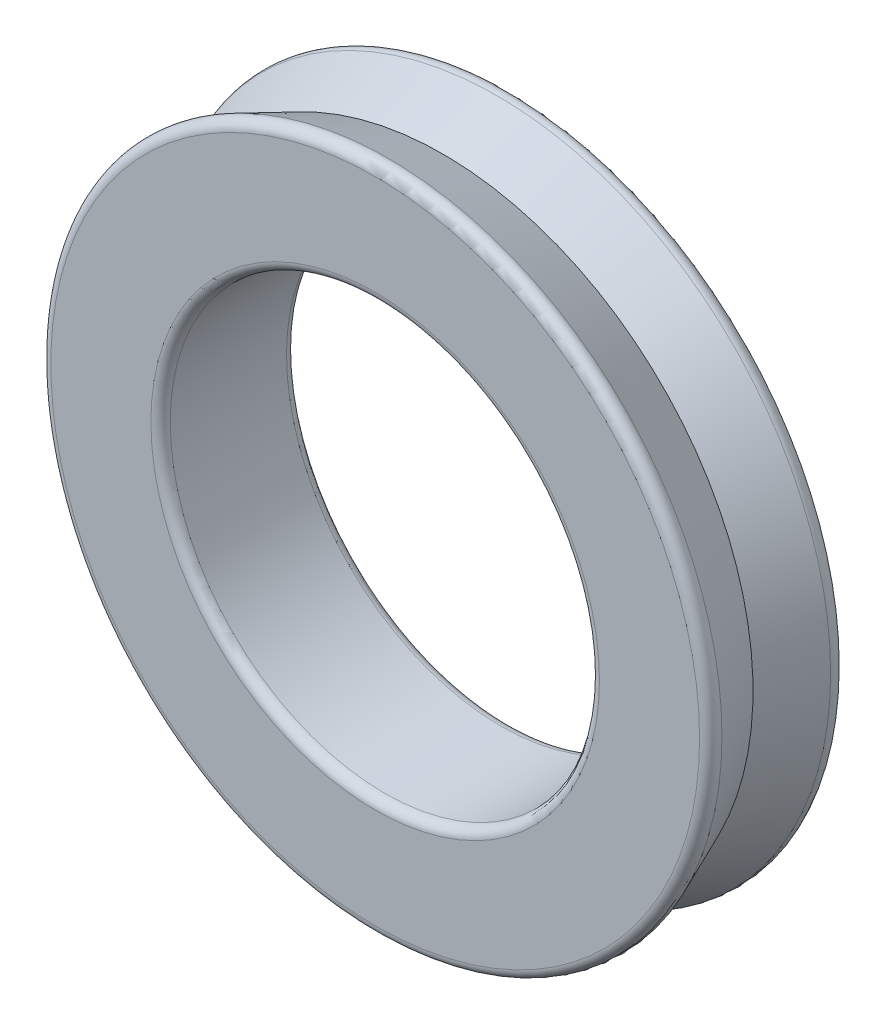
ISO-10303-21;
HEADER;
FILE_DESCRIPTION(('STEP AP214'),'2;1');
FILE_NAME('part.step','',(''),(''),'','','');
FILE_SCHEMA(('AUTOMOTIVE_DESIGN { 1 0 10303 214 1 1 1 1 }'));
ENDSEC;
DATA;
#1=APPLICATION_CONTEXT('core data for automotive mechanical design processes');
#2=APPLICATION_PROTOCOL_DEFINITION('international standard','automotive_design',2000,#1);
#3=PRODUCT_CONTEXT('',#1,'mechanical');
#4=PRODUCT('Part','Part','',(#3));
#5=PRODUCT_RELATED_PRODUCT_CATEGORY('part','',(#4));
#6=PRODUCT_DEFINITION_FORMATION('','',#4);
#7=PRODUCT_DEFINITION_CONTEXT('part definition',#1,'design');
#8=PRODUCT_DEFINITION('design','',#6,#7);
#9=PRODUCT_DEFINITION_SHAPE('','',#8);
#10=(LENGTH_UNIT() NAMED_UNIT(*) SI_UNIT(.MILLI.,.METRE.));
#11=(NAMED_UNIT(*) PLANE_ANGLE_UNIT() SI_UNIT($,.RADIAN.));
#12=(NAMED_UNIT(*) SI_UNIT($,.STERADIAN.) SOLID_ANGLE_UNIT());
#13=UNCERTAINTY_MEASURE_WITH_UNIT(LENGTH_MEASURE(1.E-05),#10,'distance_accuracy_value','');
#14=(GEOMETRIC_REPRESENTATION_CONTEXT(3) GLOBAL_UNCERTAINTY_ASSIGNED_CONTEXT((#13)) GLOBAL_UNIT_ASSIGNED_CONTEXT((#10,
#11,#12)) REPRESENTATION_CONTEXT('',''));
#15=CARTESIAN_POINT('',(0.,0.,0.));
#16=DIRECTION('',(0.,0.,1.));
#17=DIRECTION('',(1.,0.,0.));
#18=AXIS2_PLACEMENT_3D('',#15,#16,#17);
#19=CARTESIAN_POINT('',(0.,0.,7.));
#20=DIRECTION('',(0.,0.,1.));
#21=DIRECTION('',(1.,0.,0.));
#22=AXIS2_PLACEMENT_3D('',#19,#20,#21);
#23=PLANE('',#22);
#24=CARTESIAN_POINT('',(0.,0.,7.));
#25=DIRECTION('',(0.,0.,1.));
#26=DIRECTION('',(1.,0.,0.));
#27=AXIS2_PLACEMENT_3D('',#24,#25,#26);
#28=CIRCLE('',#27,11.575);
#29=CARTESIAN_POINT('',(11.575,0.,7.));
#30=VERTEX_POINT('',#29);
#31=EDGE_CURVE('E42',#30,#30,#28,.F.);
#32=ORIENTED_EDGE('',*,*,#31,.T.);
#33=EDGE_LOOP('',(#32));
#34=FACE_BOUND('',#33,.T.);
#35=CARTESIAN_POINT('',(0.,0.,7.));
#36=DIRECTION('',(0.,0.,1.));
#37=DIRECTION('',(1.,0.,0.));
#38=AXIS2_PLACEMENT_3D('',#35,#36,#37);
#39=CIRCLE('',#38,16.7417304924383);
#40=CARTESIAN_POINT('',(16.7417304924383,0.,7.));
#41=VERTEX_POINT('',#40);
#42=EDGE_CURVE('E61',#41,#41,#39,.T.);
#43=ORIENTED_EDGE('',*,*,#42,.T.);
#44=EDGE_LOOP('',(#43));
#45=FACE_BOUND('',#44,.T.);
#46=ADVANCED_FACE('F35',(#34,#45),#23,.T.);
#47=CARTESIAN_POINT('',(0.,0.,0.));
#48=DIRECTION('',(0.,0.,1.));
#49=DIRECTION('',(1.,0.,0.));
#50=AXIS2_PLACEMENT_3D('',#47,#48,#49);
#51=PLANE('',#50);
#52=CARTESIAN_POINT('',(0.,0.,0.));
#53=DIRECTION('',(0.,0.,1.));
#54=DIRECTION('',(1.,0.,0.));
#55=AXIS2_PLACEMENT_3D('',#52,#53,#54);
#56=CIRCLE('',#55,11.575);
#57=CARTESIAN_POINT('',(11.575,0.,0.));
#58=VERTEX_POINT('',#57);
#59=EDGE_CURVE('E10',#58,#58,#56,.T.);
#60=ORIENTED_EDGE('',*,*,#59,.T.);
#61=EDGE_LOOP('',(#60));
#62=FACE_BOUND('',#61,.T.);
#63=CARTESIAN_POINT('',(0.,0.,0.));
#64=DIRECTION('',(0.,0.,1.));
#65=DIRECTION('',(1.,0.,0.));
#66=AXIS2_PLACEMENT_3D('',#63,#64,#65);
#67=CIRCLE('',#66,16.7417304924383);
#68=CARTESIAN_POINT('',(16.7417304924383,0.,0.));
#69=VERTEX_POINT('',#68);
#70=EDGE_CURVE('E58',#69,#69,#67,.F.);
#71=ORIENTED_EDGE('',*,*,#70,.T.);
#72=EDGE_LOOP('',(#71));
#73=FACE_BOUND('',#72,.T.);
#74=ADVANCED_FACE('F89',(#62,#73),#51,.F.);
#75=CARTESIAN_POINT('',(0.,0.,7.));
#76=DIRECTION('',(0.,0.,-1.));
#77=DIRECTION('',(-1.,0.,0.));
#78=AXIS2_PLACEMENT_3D('',#75,#76,#77);
#79=CYLINDRICAL_SURFACE('',#78,11.075);
#80=CARTESIAN_POINT('',(0.,0.,6.5));
#81=DIRECTION('',(0.,0.,1.));
#82=DIRECTION('',(1.,0.,0.));
#83=AXIS2_PLACEMENT_3D('',#80,#81,#82);
#84=CIRCLE('',#83,11.075);
#85=CARTESIAN_POINT('',(11.075,0.,6.5));
#86=VERTEX_POINT('',#85);
#87=EDGE_CURVE('E46',#86,#86,#84,.T.);
#88=ORIENTED_EDGE('',*,*,#87,.T.);
#89=EDGE_LOOP('',(#88));
#90=FACE_BOUND('',#89,.T.);
#91=CARTESIAN_POINT('',(0.,0.,0.5));
#92=DIRECTION('',(0.,0.,1.));
#93=DIRECTION('',(1.,0.,0.));
#94=AXIS2_PLACEMENT_3D('',#91,#92,#93);
#95=CIRCLE('',#94,11.075);
#96=CARTESIAN_POINT('',(11.075,0.,0.5));
#97=VERTEX_POINT('',#96);
#98=EDGE_CURVE('E50',#97,#97,#95,.F.);
#99=ORIENTED_EDGE('',*,*,#98,.T.);
#100=EDGE_LOOP('',(#99));
#101=FACE_BOUND('',#100,.T.);
#102=ADVANCED_FACE('F85',(#90,#101),#79,.F.);
#103=CARTESIAN_POINT('',(0.,0.,0.));
#104=DIRECTION('',(0.,0.,-1.));
#105=DIRECTION('',(-1.,0.,0.));
#106=AXIS2_PLACEMENT_3D('',#103,#104,#105);
#107=CONICAL_SURFACE('',#106,17.5,0.404891786285085);
#108=CARTESIAN_POINT('',(0.,0.,0.696959649289584));
#109=DIRECTION('',(0.,0.,-1.));
#110=DIRECTION('',(-1.,0.,0.));
#111=AXIS2_PLACEMENT_3D('',#108,#109,#110);
#112=CIRCLE('',#111,17.2013030074473);
#113=CARTESIAN_POINT('',(-17.2013030074473,0.,0.696959649289584));
#114=VERTEX_POINT('',#113);
#115=EDGE_CURVE('E55',#114,#114,#112,.F.);
#116=ORIENTED_EDGE('',*,*,#115,.T.);
#117=EDGE_LOOP('',(#116));
#118=FACE_BOUND('',#117,.T.);
#119=CARTESIAN_POINT('',(0.,0.,3.5));
#120=DIRECTION('',(0.,0.,-1.));
#121=DIRECTION('',(-1.,0.,0.));
#122=AXIS2_PLACEMENT_3D('',#119,#120,#121);
#123=CIRCLE('',#122,16.);
#124=CARTESIAN_POINT('',(-16.,0.,3.5));
#125=VERTEX_POINT('',#124);
#126=EDGE_CURVE('E67',#125,#125,#123,.T.);
#127=ORIENTED_EDGE('',*,*,#126,.T.);
#128=EDGE_LOOP('',(#127));
#129=FACE_BOUND('',#128,.T.);
#130=ADVANCED_FACE('F71',(#118,#129),#107,.T.);
#131=CARTESIAN_POINT('',(0.,0.,3.5));
#132=DIRECTION('',(0.,0.,1.));
#133=DIRECTION('',(1.,0.,0.));
#134=AXIS2_PLACEMENT_3D('',#131,#132,#133);
#135=CONICAL_SURFACE('',#134,16.,0.404891786285085);
#136=CARTESIAN_POINT('',(0.,0.,6.30304035071042));
#137=DIRECTION('',(0.,0.,-1.));
#138=DIRECTION('',(-1.,0.,0.));
#139=AXIS2_PLACEMENT_3D('',#136,#137,#138);
#140=CIRCLE('',#139,17.2013030074473);
#141=CARTESIAN_POINT('',(-17.2013030074473,0.,6.30304035071042));
#142=VERTEX_POINT('',#141);
#143=EDGE_CURVE('E64',#142,#142,#140,.T.);
#144=ORIENTED_EDGE('',*,*,#143,.T.);
#145=EDGE_LOOP('',(#144));
#146=FACE_BOUND('',#145,.T.);
#147=ORIENTED_EDGE('',*,*,#126,.F.);
#148=EDGE_LOOP('',(#147));
#149=FACE_BOUND('',#148,.T.);
#150=ADVANCED_FACE('F73',(#146,#149),#135,.T.);
#151=CARTESIAN_POINT('',(0.,0.,6.5));
#152=DIRECTION('',(0.,0.,1.));
#153=DIRECTION('',(1.,0.,0.));
#154=AXIS2_PLACEMENT_3D('',#151,#152,#153);
#155=TOROIDAL_SURFACE('',#154,16.7417304924383,0.5);
#156=ORIENTED_EDGE('',*,*,#42,.F.);
#157=EDGE_LOOP('',(#156));
#158=FACE_BOUND('',#157,.T.);
#159=ORIENTED_EDGE('',*,*,#143,.F.);
#160=EDGE_LOOP('',(#159));
#161=FACE_BOUND('',#160,.T.);
#162=ADVANCED_FACE('F75',(#158,#161),#155,.T.);
#163=CARTESIAN_POINT('',(0.,0.,0.5));
#164=DIRECTION('',(0.,0.,1.));
#165=DIRECTION('',(1.,0.,0.));
#166=AXIS2_PLACEMENT_3D('',#163,#164,#165);
#167=TOROIDAL_SURFACE('',#166,16.7417304924383,0.5);
#168=ORIENTED_EDGE('',*,*,#115,.F.);
#169=EDGE_LOOP('',(#168));
#170=FACE_BOUND('',#169,.T.);
#171=ORIENTED_EDGE('',*,*,#70,.F.);
#172=EDGE_LOOP('',(#171));
#173=FACE_BOUND('',#172,.T.);
#174=ADVANCED_FACE('F82',(#170,#173),#167,.T.);
#175=CARTESIAN_POINT('',(0.,0.,6.5));
#176=DIRECTION('',(0.,0.,1.));
#177=DIRECTION('',(1.,0.,0.));
#178=AXIS2_PLACEMENT_3D('',#175,#176,#177);
#179=TOROIDAL_SURFACE('',#178,11.575,0.5);
#180=ORIENTED_EDGE('',*,*,#31,.F.);
#181=EDGE_LOOP('',(#180));
#182=FACE_BOUND('',#181,.T.);
#183=ORIENTED_EDGE('',*,*,#87,.F.);
#184=EDGE_LOOP('',(#183));
#185=FACE_BOUND('',#184,.T.);
#186=ADVANCED_FACE('F99',(#182,#185),#179,.T.);
#187=CARTESIAN_POINT('',(0.,0.,0.5));
#188=DIRECTION('',(0.,0.,1.));
#189=DIRECTION('',(1.,0.,0.));
#190=AXIS2_PLACEMENT_3D('',#187,#188,#189);
#191=TOROIDAL_SURFACE('',#190,11.575,0.5);
#192=ORIENTED_EDGE('',*,*,#98,.F.);
#193=EDGE_LOOP('',(#192));
#194=FACE_BOUND('',#193,.T.);
#195=ORIENTED_EDGE('',*,*,#59,.F.);
#196=EDGE_LOOP('',(#195));
#197=FACE_BOUND('',#196,.T.);
#198=ADVANCED_FACE('F37',(#194,#197),#191,.T.);
#199=CLOSED_SHELL('',(#46,#74,#102,#130,#150,#162,#174,#186,#198));
#200=MANIFOLD_SOLID_BREP('B2',#199);
#201=ADVANCED_BREP_SHAPE_REPRESENTATION('',(#18,#200),#14);
#202=SHAPE_DEFINITION_REPRESENTATION(#9,#201);
ENDSEC;
END-ISO-10303-21;
